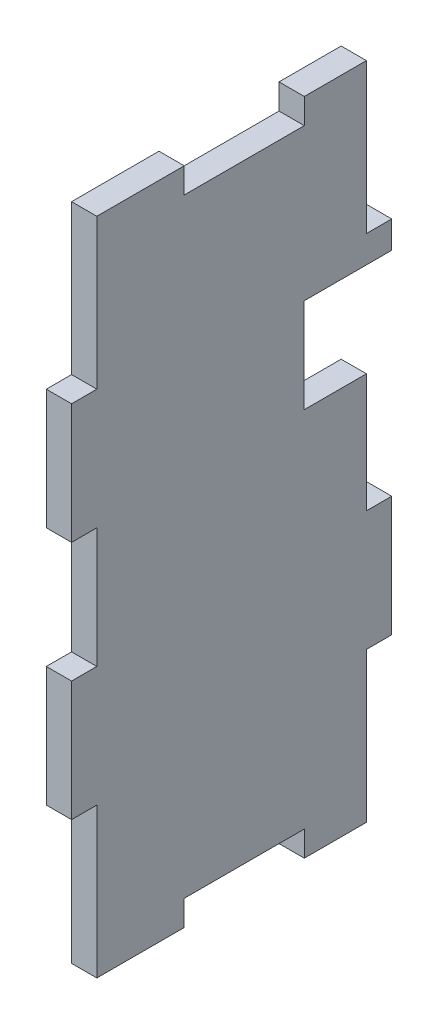
ISO-10303-21;
HEADER;
FILE_DESCRIPTION(('STEP AP214'),'2;1');
FILE_NAME('part.step','',(''),(''),'','','');
FILE_SCHEMA(('AUTOMOTIVE_DESIGN { 1 0 10303 214 1 1 1 1 }'));
ENDSEC;
DATA;
#1=APPLICATION_CONTEXT('core data for automotive mechanical design processes');
#2=APPLICATION_PROTOCOL_DEFINITION('international standard','automotive_design',2000,#1);
#3=PRODUCT_CONTEXT('',#1,'mechanical');
#4=PRODUCT('Part','Part','',(#3));
#5=PRODUCT_RELATED_PRODUCT_CATEGORY('part','',(#4));
#6=PRODUCT_DEFINITION_FORMATION('','',#4);
#7=PRODUCT_DEFINITION_CONTEXT('part definition',#1,'design');
#8=PRODUCT_DEFINITION('design','',#6,#7);
#9=PRODUCT_DEFINITION_SHAPE('','',#8);
#10=(LENGTH_UNIT() NAMED_UNIT(*) SI_UNIT(.MILLI.,.METRE.));
#11=(NAMED_UNIT(*) PLANE_ANGLE_UNIT() SI_UNIT($,.RADIAN.));
#12=(NAMED_UNIT(*) SI_UNIT($,.STERADIAN.) SOLID_ANGLE_UNIT());
#13=UNCERTAINTY_MEASURE_WITH_UNIT(LENGTH_MEASURE(1.E-05),#10,'distance_accuracy_value','');
#14=(GEOMETRIC_REPRESENTATION_CONTEXT(3) GLOBAL_UNCERTAINTY_ASSIGNED_CONTEXT((#13)) GLOBAL_UNIT_ASSIGNED_CONTEXT((#10,
#11,#12)) REPRESENTATION_CONTEXT('',''));
#15=CARTESIAN_POINT('',(0.,0.,0.));
#16=DIRECTION('',(0.,0.,1.));
#17=DIRECTION('',(1.,0.,0.));
#18=AXIS2_PLACEMENT_3D('',#15,#16,#17);
#19=CARTESIAN_POINT('',(3.,36.9830920693521,8.18285979631578));
#20=DIRECTION('',(0.,-1.,0.));
#21=DIRECTION('',(0.,0.,-1.));
#22=AXIS2_PLACEMENT_3D('',#19,#20,#21);
#23=PLANE('',#22);
#24=DIRECTION('',(0.,0.,1.));
#25=VECTOR('',#24,1.);
#26=CARTESIAN_POINT('',(0.,36.9830920693521,8.18285979631578));
#27=LINE('',#26,#25);
#28=CARTESIAN_POINT('',(0.,36.9830920693521,8.18285979631578));
#29=VERTEX_POINT('',#28);
#30=CARTESIAN_POINT('',(0.,36.9830920693521,18.5578597963158));
#31=VERTEX_POINT('',#30);
#32=EDGE_CURVE('E490',#29,#31,#27,.T.);
#33=ORIENTED_EDGE('',*,*,#32,.T.);
#34=DIRECTION('',(-1.,0.,0.));
#35=VECTOR('',#34,1.);
#36=CARTESIAN_POINT('',(3.,36.9830920693521,18.5578597963158));
#37=LINE('',#36,#35);
#38=CARTESIAN_POINT('',(3.,36.9830920693521,18.5578597963158));
#39=VERTEX_POINT('',#38);
#40=EDGE_CURVE('E531',#39,#31,#37,.T.);
#41=ORIENTED_EDGE('',*,*,#40,.F.);
#42=DIRECTION('',(0.,0.,1.));
#43=VECTOR('',#42,1.);
#44=CARTESIAN_POINT('',(3.,36.9830920693521,8.18285979631578));
#45=LINE('',#44,#43);
#46=CARTESIAN_POINT('',(3.,36.9830920693521,8.18285979631578));
#47=VERTEX_POINT('',#46);
#48=EDGE_CURVE('E280',#47,#39,#45,.T.);
#49=ORIENTED_EDGE('',*,*,#48,.F.);
#50=DIRECTION('',(-1.,0.,0.));
#51=VECTOR('',#50,1.);
#52=CARTESIAN_POINT('',(3.,36.9830920693521,8.18285979631578));
#53=LINE('',#52,#51);
#54=EDGE_CURVE('E264',#47,#29,#53,.T.);
#55=ORIENTED_EDGE('',*,*,#54,.T.);
#56=EDGE_LOOP('',(#33,#41,#49,#55));
#57=FACE_BOUND('',#56,.T.);
#58=ADVANCED_FACE('F46',(#57),#23,.F.);
#59=CARTESIAN_POINT('',(3.,36.9830920693521,18.5578597963158));
#60=DIRECTION('',(0.,0.,-1.));
#61=DIRECTION('',(-1.,0.,0.));
#62=AXIS2_PLACEMENT_3D('',#59,#60,#61);
#63=PLANE('',#62);
#64=DIRECTION('',(0.,-1.,0.));
#65=VECTOR('',#64,1.);
#66=CARTESIAN_POINT('',(0.,36.9830920693521,18.5578597963158));
#67=LINE('',#66,#65);
#68=CARTESIAN_POINT('',(0.,19.2080920693521,18.5578597963158));
#69=VERTEX_POINT('',#68);
#70=EDGE_CURVE('E487',#31,#69,#67,.T.);
#71=ORIENTED_EDGE('',*,*,#70,.T.);
#72=DIRECTION('',(-1.,0.,0.));
#73=VECTOR('',#72,1.);
#74=CARTESIAN_POINT('',(3.,19.2080920693521,18.5578597963158));
#75=LINE('',#74,#73);
#76=CARTESIAN_POINT('',(3.,19.2080920693521,18.5578597963158));
#77=VERTEX_POINT('',#76);
#78=EDGE_CURVE('E535',#77,#69,#75,.T.);
#79=ORIENTED_EDGE('',*,*,#78,.F.);
#80=DIRECTION('',(0.,-1.,0.));
#81=VECTOR('',#80,1.);
#82=CARTESIAN_POINT('',(3.,36.9830920693521,18.5578597963158));
#83=LINE('',#82,#81);
#84=EDGE_CURVE('E166',#39,#77,#83,.T.);
#85=ORIENTED_EDGE('',*,*,#84,.F.);
#86=ORIENTED_EDGE('',*,*,#40,.T.);
#87=EDGE_LOOP('',(#71,#79,#85,#86));
#88=FACE_BOUND('',#87,.T.);
#89=ADVANCED_FACE('F630',(#88),#63,.F.);
#90=CARTESIAN_POINT('',(3.,19.2080920693521,18.5578597963158));
#91=DIRECTION('',(0.,-1.,0.));
#92=DIRECTION('',(0.,0.,-1.));
#93=AXIS2_PLACEMENT_3D('',#90,#91,#92);
#94=PLANE('',#93);
#95=DIRECTION('',(0.,0.,1.));
#96=VECTOR('',#95,1.);
#97=CARTESIAN_POINT('',(0.,19.2080920693521,18.5578597963158));
#98=LINE('',#97,#96);
#99=CARTESIAN_POINT('',(0.,19.2080920693521,21.5578597963158));
#100=VERTEX_POINT('',#99);
#101=EDGE_CURVE('E484',#69,#100,#98,.T.);
#102=ORIENTED_EDGE('',*,*,#101,.T.);
#103=DIRECTION('',(-1.,0.,0.));
#104=VECTOR('',#103,1.);
#105=CARTESIAN_POINT('',(3.,19.2080920693521,21.5578597963158));
#106=LINE('',#105,#104);
#107=CARTESIAN_POINT('',(3.,19.2080920693521,21.5578597963158));
#108=VERTEX_POINT('',#107);
#109=EDGE_CURVE('E541',#108,#100,#106,.T.);
#110=ORIENTED_EDGE('',*,*,#109,.F.);
#111=DIRECTION('',(0.,0.,1.));
#112=VECTOR('',#111,1.);
#113=CARTESIAN_POINT('',(3.,19.2080920693521,18.5578597963158));
#114=LINE('',#113,#112);
#115=EDGE_CURVE('E289',#77,#108,#114,.T.);
#116=ORIENTED_EDGE('',*,*,#115,.F.);
#117=ORIENTED_EDGE('',*,*,#78,.T.);
#118=EDGE_LOOP('',(#102,#110,#116,#117));
#119=FACE_BOUND('',#118,.T.);
#120=ADVANCED_FACE('F632',(#119),#94,.F.);
#121=CARTESIAN_POINT('',(3.,19.2080920693521,21.5578597963158));
#122=DIRECTION('',(0.,0.,-1.));
#123=DIRECTION('',(-1.,0.,0.));
#124=AXIS2_PLACEMENT_3D('',#121,#122,#123);
#125=PLANE('',#124);
#126=DIRECTION('',(0.,-1.,0.));
#127=VECTOR('',#126,1.);
#128=CARTESIAN_POINT('',(0.,19.2080920693521,21.5578597963158));
#129=LINE('',#128,#127);
#130=CARTESIAN_POINT('',(0.,4.95809206935212,21.5578597963158));
#131=VERTEX_POINT('',#130);
#132=EDGE_CURVE('E481',#100,#131,#129,.T.);
#133=ORIENTED_EDGE('',*,*,#132,.T.);
#134=DIRECTION('',(-1.,0.,0.));
#135=VECTOR('',#134,1.);
#136=CARTESIAN_POINT('',(3.,4.95809206935212,21.5578597963158));
#137=LINE('',#136,#135);
#138=CARTESIAN_POINT('',(3.,4.95809206935212,21.5578597963158));
#139=VERTEX_POINT('',#138);
#140=EDGE_CURVE('E545',#139,#131,#137,.T.);
#141=ORIENTED_EDGE('',*,*,#140,.F.);
#142=DIRECTION('',(0.,-1.,0.));
#143=VECTOR('',#142,1.);
#144=CARTESIAN_POINT('',(3.,19.2080920693521,21.5578597963158));
#145=LINE('',#144,#143);
#146=EDGE_CURVE('E293',#108,#139,#145,.T.);
#147=ORIENTED_EDGE('',*,*,#146,.F.);
#148=ORIENTED_EDGE('',*,*,#109,.T.);
#149=EDGE_LOOP('',(#133,#141,#147,#148));
#150=FACE_BOUND('',#149,.T.);
#151=ADVANCED_FACE('F637',(#150),#125,.F.);
#152=CARTESIAN_POINT('',(3.,4.95809206935212,21.5578597963158));
#153=DIRECTION('',(0.,1.,0.));
#154=DIRECTION('',(0.,0.,1.));
#155=AXIS2_PLACEMENT_3D('',#152,#153,#154);
#156=PLANE('',#155);
#157=DIRECTION('',(0.,0.,-1.));
#158=VECTOR('',#157,1.);
#159=CARTESIAN_POINT('',(0.,4.95809206935212,21.5578597963158));
#160=LINE('',#159,#158);
#161=CARTESIAN_POINT('',(0.,4.95809206935212,18.5578597963158));
#162=VERTEX_POINT('',#161);
#163=EDGE_CURVE('E478',#131,#162,#160,.T.);
#164=ORIENTED_EDGE('',*,*,#163,.T.);
#165=DIRECTION('',(-1.,0.,0.));
#166=VECTOR('',#165,1.);
#167=CARTESIAN_POINT('',(3.,4.95809206935212,18.5578597963158));
#168=LINE('',#167,#166);
#169=CARTESIAN_POINT('',(3.,4.95809206935212,18.5578597963158));
#170=VERTEX_POINT('',#169);
#171=EDGE_CURVE('E549',#170,#162,#168,.T.);
#172=ORIENTED_EDGE('',*,*,#171,.F.);
#173=DIRECTION('',(0.,0.,-1.));
#174=VECTOR('',#173,1.);
#175=CARTESIAN_POINT('',(3.,4.95809206935212,21.5578597963158));
#176=LINE('',#175,#174);
#177=EDGE_CURVE('E301',#139,#170,#176,.T.);
#178=ORIENTED_EDGE('',*,*,#177,.F.);
#179=ORIENTED_EDGE('',*,*,#140,.T.);
#180=EDGE_LOOP('',(#164,#172,#178,#179));
#181=FACE_BOUND('',#180,.T.);
#182=ADVANCED_FACE('F643',(#181),#156,.F.);
#183=CARTESIAN_POINT('',(3.,4.95809206935212,18.5578597963158));
#184=DIRECTION('',(0.,0.,-1.));
#185=DIRECTION('',(-1.,0.,0.));
#186=AXIS2_PLACEMENT_3D('',#183,#184,#185);
#187=PLANE('',#186);
#188=DIRECTION('',(0.,-1.,0.));
#189=VECTOR('',#188,1.);
#190=CARTESIAN_POINT('',(0.,4.95809206935212,18.5578597963158));
#191=LINE('',#190,#189);
#192=CARTESIAN_POINT('',(0.,-9.29190793064787,18.5578597963158));
#193=VERTEX_POINT('',#192);
#194=EDGE_CURVE('E475',#162,#193,#191,.T.);
#195=ORIENTED_EDGE('',*,*,#194,.T.);
#196=DIRECTION('',(-1.,0.,0.));
#197=VECTOR('',#196,1.);
#198=CARTESIAN_POINT('',(3.,-9.29190793064787,18.5578597963158));
#199=LINE('',#198,#197);
#200=CARTESIAN_POINT('',(3.,-9.29190793064787,18.5578597963158));
#201=VERTEX_POINT('',#200);
#202=EDGE_CURVE('E553',#201,#193,#199,.T.);
#203=ORIENTED_EDGE('',*,*,#202,.F.);
#204=DIRECTION('',(0.,-1.,0.));
#205=VECTOR('',#204,1.);
#206=CARTESIAN_POINT('',(3.,4.95809206935212,18.5578597963158));
#207=LINE('',#206,#205);
#208=EDGE_CURVE('E304',#170,#201,#207,.T.);
#209=ORIENTED_EDGE('',*,*,#208,.F.);
#210=ORIENTED_EDGE('',*,*,#171,.T.);
#211=EDGE_LOOP('',(#195,#203,#209,#210));
#212=FACE_BOUND('',#211,.T.);
#213=ADVANCED_FACE('F647',(#212),#187,.F.);
#214=CARTESIAN_POINT('',(3.,-9.29190793064787,18.5578597963158));
#215=DIRECTION('',(0.,-1.,0.));
#216=DIRECTION('',(0.,0.,-1.));
#217=AXIS2_PLACEMENT_3D('',#214,#215,#216);
#218=PLANE('',#217);
#219=DIRECTION('',(0.,0.,1.));
#220=VECTOR('',#219,1.);
#221=CARTESIAN_POINT('',(0.,-9.29190793064787,18.5578597963158));
#222=LINE('',#221,#220);
#223=CARTESIAN_POINT('',(0.,-9.29190793064787,21.5578597963158));
#224=VERTEX_POINT('',#223);
#225=EDGE_CURVE('E472',#193,#224,#222,.T.);
#226=ORIENTED_EDGE('',*,*,#225,.T.);
#227=DIRECTION('',(-1.,0.,0.));
#228=VECTOR('',#227,1.);
#229=CARTESIAN_POINT('',(3.,-9.29190793064787,21.5578597963158));
#230=LINE('',#229,#228);
#231=CARTESIAN_POINT('',(3.,-9.29190793064787,21.5578597963158));
#232=VERTEX_POINT('',#231);
#233=EDGE_CURVE('E557',#232,#224,#230,.T.);
#234=ORIENTED_EDGE('',*,*,#233,.F.);
#235=DIRECTION('',(0.,0.,1.));
#236=VECTOR('',#235,1.);
#237=CARTESIAN_POINT('',(3.,-9.29190793064787,18.5578597963158));
#238=LINE('',#237,#236);
#239=EDGE_CURVE('E308',#201,#232,#238,.T.);
#240=ORIENTED_EDGE('',*,*,#239,.F.);
#241=ORIENTED_EDGE('',*,*,#202,.T.);
#242=EDGE_LOOP('',(#226,#234,#240,#241));
#243=FACE_BOUND('',#242,.T.);
#244=ADVANCED_FACE('F651',(#243),#218,.F.);
#245=CARTESIAN_POINT('',(3.,-9.29190793064787,21.5578597963158));
#246=DIRECTION('',(0.,0.,-1.));
#247=DIRECTION('',(-1.,0.,0.));
#248=AXIS2_PLACEMENT_3D('',#245,#246,#247);
#249=PLANE('',#248);
#250=DIRECTION('',(0.,-1.,0.));
#251=VECTOR('',#250,1.);
#252=CARTESIAN_POINT('',(0.,-9.29190793064787,21.5578597963158));
#253=LINE('',#252,#251);
#254=CARTESIAN_POINT('',(0.,-23.5419079306479,21.5578597963158));
#255=VERTEX_POINT('',#254);
#256=EDGE_CURVE('E469',#224,#255,#253,.T.);
#257=ORIENTED_EDGE('',*,*,#256,.T.);
#258=DIRECTION('',(-1.,0.,0.));
#259=VECTOR('',#258,1.);
#260=CARTESIAN_POINT('',(3.,-23.5419079306479,21.5578597963158));
#261=LINE('',#260,#259);
#262=CARTESIAN_POINT('',(3.,-23.5419079306479,21.5578597963158));
#263=VERTEX_POINT('',#262);
#264=EDGE_CURVE('E561',#263,#255,#261,.T.);
#265=ORIENTED_EDGE('',*,*,#264,.F.);
#266=DIRECTION('',(0.,-1.,0.));
#267=VECTOR('',#266,1.);
#268=CARTESIAN_POINT('',(3.,-9.29190793064787,21.5578597963158));
#269=LINE('',#268,#267);
#270=EDGE_CURVE('E312',#232,#263,#269,.T.);
#271=ORIENTED_EDGE('',*,*,#270,.F.);
#272=ORIENTED_EDGE('',*,*,#233,.T.);
#273=EDGE_LOOP('',(#257,#265,#271,#272));
#274=FACE_BOUND('',#273,.T.);
#275=ADVANCED_FACE('F655',(#274),#249,.F.);
#276=CARTESIAN_POINT('',(3.,-23.5419079306479,21.5578597963158));
#277=DIRECTION('',(0.,1.,0.));
#278=DIRECTION('',(0.,0.,1.));
#279=AXIS2_PLACEMENT_3D('',#276,#277,#278);
#280=PLANE('',#279);
#281=DIRECTION('',(0.,0.,-1.));
#282=VECTOR('',#281,1.);
#283=CARTESIAN_POINT('',(0.,-23.5419079306479,21.5578597963158));
#284=LINE('',#283,#282);
#285=CARTESIAN_POINT('',(0.,-23.5419079306479,18.5578597963158));
#286=VERTEX_POINT('',#285);
#287=EDGE_CURVE('E465',#255,#286,#284,.T.);
#288=ORIENTED_EDGE('',*,*,#287,.T.);
#289=DIRECTION('',(-1.,0.,0.));
#290=VECTOR('',#289,1.);
#291=CARTESIAN_POINT('',(3.,-23.5419079306479,18.5578597963158));
#292=LINE('',#291,#290);
#293=CARTESIAN_POINT('',(3.,-23.5419079306479,18.5578597963158));
#294=VERTEX_POINT('',#293);
#295=EDGE_CURVE('E565',#294,#286,#292,.T.);
#296=ORIENTED_EDGE('',*,*,#295,.F.);
#297=DIRECTION('',(0.,0.,-1.));
#298=VECTOR('',#297,1.);
#299=CARTESIAN_POINT('',(3.,-23.5419079306479,21.5578597963158));
#300=LINE('',#299,#298);
#301=EDGE_CURVE('E320',#263,#294,#300,.T.);
#302=ORIENTED_EDGE('',*,*,#301,.F.);
#303=ORIENTED_EDGE('',*,*,#264,.T.);
#304=EDGE_LOOP('',(#288,#296,#302,#303));
#305=FACE_BOUND('',#304,.T.);
#306=ADVANCED_FACE('F659',(#305),#280,.F.);
#307=CARTESIAN_POINT('',(3.,-37.7919079306479,18.5578597963158));
#308=DIRECTION('',(0.,0.,-1.));
#309=DIRECTION('',(-1.,0.,0.));
#310=AXIS2_PLACEMENT_3D('',#307,#308,#309);
#311=PLANE('',#310);
#312=DIRECTION('',(0.,-1.,0.));
#313=VECTOR('',#312,1.);
#314=CARTESIAN_POINT('',(0.,-37.7919079306479,18.5578597963158));
#315=LINE('',#314,#313);
#316=CARTESIAN_POINT('',(0.,-41.3169079306479,18.5578597963158));
#317=VERTEX_POINT('',#316);
#318=EDGE_CURVE('E462',#286,#317,#315,.T.);
#319=ORIENTED_EDGE('',*,*,#318,.T.);
#320=DIRECTION('',(-1.,0.,0.));
#321=VECTOR('',#320,1.);
#322=CARTESIAN_POINT('',(3.,-41.3169079306479,18.5578597963158));
#323=LINE('',#322,#321);
#324=CARTESIAN_POINT('',(3.,-41.3169079306479,18.5578597963158));
#325=VERTEX_POINT('',#324);
#326=EDGE_CURVE('E569',#325,#317,#323,.T.);
#327=ORIENTED_EDGE('',*,*,#326,.F.);
#328=DIRECTION('',(0.,-1.,0.));
#329=VECTOR('',#328,1.);
#330=CARTESIAN_POINT('',(3.,-23.5419079306479,18.5578597963158));
#331=LINE('',#330,#329);
#332=EDGE_CURVE('E323',#294,#325,#331,.T.);
#333=ORIENTED_EDGE('',*,*,#332,.F.);
#334=ORIENTED_EDGE('',*,*,#295,.T.);
#335=EDGE_LOOP('',(#319,#327,#333,#334));
#336=FACE_BOUND('',#335,.T.);
#337=ADVANCED_FACE('F663',(#336),#311,.F.);
#338=CARTESIAN_POINT('',(3.,-41.3169079306479,18.5578597963158));
#339=DIRECTION('',(0.,1.,0.));
#340=DIRECTION('',(0.,0.,1.));
#341=AXIS2_PLACEMENT_3D('',#338,#339,#340);
#342=PLANE('',#341);
#343=DIRECTION('',(0.,0.,-1.));
#344=VECTOR('',#343,1.);
#345=CARTESIAN_POINT('',(0.,-41.3169079306479,18.5578597963158));
#346=LINE('',#345,#344);
#347=CARTESIAN_POINT('',(0.,-41.3169079306479,8.18285979631578));
#348=VERTEX_POINT('',#347);
#349=EDGE_CURVE('E459',#317,#348,#346,.T.);
#350=ORIENTED_EDGE('',*,*,#349,.T.);
#351=DIRECTION('',(-1.,0.,0.));
#352=VECTOR('',#351,1.);
#353=CARTESIAN_POINT('',(3.,-41.3169079306479,8.18285979631578));
#354=LINE('',#353,#352);
#355=CARTESIAN_POINT('',(3.,-41.3169079306479,8.18285979631578));
#356=VERTEX_POINT('',#355);
#357=EDGE_CURVE('E573',#356,#348,#354,.T.);
#358=ORIENTED_EDGE('',*,*,#357,.F.);
#359=DIRECTION('',(0.,0.,-1.));
#360=VECTOR('',#359,1.);
#361=CARTESIAN_POINT('',(3.,-41.3169079306479,18.5578597963158));
#362=LINE('',#361,#360);
#363=EDGE_CURVE('E327',#325,#356,#362,.T.);
#364=ORIENTED_EDGE('',*,*,#363,.F.);
#365=ORIENTED_EDGE('',*,*,#326,.T.);
#366=EDGE_LOOP('',(#350,#358,#364,#365));
#367=FACE_BOUND('',#366,.T.);
#368=ADVANCED_FACE('F667',(#367),#342,.F.);
#369=CARTESIAN_POINT('',(3.,-41.3169079306479,8.18285979631578));
#370=DIRECTION('',(0.,0.,1.));
#371=DIRECTION('',(1.,0.,0.));
#372=AXIS2_PLACEMENT_3D('',#369,#370,#371);
#373=PLANE('',#372);
#374=DIRECTION('',(0.,1.,0.));
#375=VECTOR('',#374,1.);
#376=CARTESIAN_POINT('',(0.,-41.3169079306479,8.18285979631578));
#377=LINE('',#376,#375);
#378=CARTESIAN_POINT('',(0.,-38.3169079306479,8.18285979631578));
#379=VERTEX_POINT('',#378);
#380=EDGE_CURVE('E456',#348,#379,#377,.T.);
#381=ORIENTED_EDGE('',*,*,#380,.T.);
#382=DIRECTION('',(-1.,0.,0.));
#383=VECTOR('',#382,1.);
#384=CARTESIAN_POINT('',(3.,-38.3169079306479,8.18285979631578));
#385=LINE('',#384,#383);
#386=CARTESIAN_POINT('',(3.,-38.3169079306479,8.18285979631578));
#387=VERTEX_POINT('',#386);
#388=EDGE_CURVE('E577',#387,#379,#385,.T.);
#389=ORIENTED_EDGE('',*,*,#388,.F.);
#390=DIRECTION('',(0.,1.,0.));
#391=VECTOR('',#390,1.);
#392=CARTESIAN_POINT('',(3.,-41.3169079306479,8.18285979631578));
#393=LINE('',#392,#391);
#394=EDGE_CURVE('E331',#356,#387,#393,.T.);
#395=ORIENTED_EDGE('',*,*,#394,.F.);
#396=ORIENTED_EDGE('',*,*,#357,.T.);
#397=EDGE_LOOP('',(#381,#389,#395,#396));
#398=FACE_BOUND('',#397,.T.);
#399=ADVANCED_FACE('F671',(#398),#373,.F.);
#400=CARTESIAN_POINT('',(3.,-38.3169079306479,8.18285979631578));
#401=DIRECTION('',(0.,1.,0.));
#402=DIRECTION('',(0.,0.,1.));
#403=AXIS2_PLACEMENT_3D('',#400,#401,#402);
#404=PLANE('',#403);
#405=DIRECTION('',(0.,0.,-1.));
#406=VECTOR('',#405,1.);
#407=CARTESIAN_POINT('',(0.,-38.3169079306479,8.18285979631578));
#408=LINE('',#407,#406);
#409=CARTESIAN_POINT('',(0.,-38.3169079306479,-6.06714020368422));
#410=VERTEX_POINT('',#409);
#411=EDGE_CURVE('E453',#379,#410,#408,.T.);
#412=ORIENTED_EDGE('',*,*,#411,.T.);
#413=DIRECTION('',(-1.,0.,0.));
#414=VECTOR('',#413,1.);
#415=CARTESIAN_POINT('',(3.,-38.3169079306479,-6.06714020368422));
#416=LINE('',#415,#414);
#417=CARTESIAN_POINT('',(3.,-38.3169079306479,-6.06714020368422));
#418=VERTEX_POINT('',#417);
#419=EDGE_CURVE('E581',#418,#410,#416,.T.);
#420=ORIENTED_EDGE('',*,*,#419,.F.);
#421=DIRECTION('',(0.,0.,-1.));
#422=VECTOR('',#421,1.);
#423=CARTESIAN_POINT('',(3.,-38.3169079306479,8.18285979631578));
#424=LINE('',#423,#422);
#425=EDGE_CURVE('E339',#387,#418,#424,.T.);
#426=ORIENTED_EDGE('',*,*,#425,.F.);
#427=ORIENTED_EDGE('',*,*,#388,.T.);
#428=EDGE_LOOP('',(#412,#420,#426,#427));
#429=FACE_BOUND('',#428,.T.);
#430=ADVANCED_FACE('F675',(#429),#404,.F.);
#431=CARTESIAN_POINT('',(3.,-38.3169079306479,-6.06714020368422));
#432=DIRECTION('',(0.,0.,-1.));
#433=DIRECTION('',(-1.,0.,0.));
#434=AXIS2_PLACEMENT_3D('',#431,#432,#433);
#435=PLANE('',#434);
#436=DIRECTION('',(0.,-1.,0.));
#437=VECTOR('',#436,1.);
#438=CARTESIAN_POINT('',(0.,-38.3169079306479,-6.06714020368422));
#439=LINE('',#438,#437);
#440=CARTESIAN_POINT('',(0.,-41.3169079306479,-6.06714020368422));
#441=VERTEX_POINT('',#440);
#442=EDGE_CURVE('E450',#410,#441,#439,.T.);
#443=ORIENTED_EDGE('',*,*,#442,.T.);
#444=DIRECTION('',(-1.,0.,0.));
#445=VECTOR('',#444,1.);
#446=CARTESIAN_POINT('',(3.,-41.3169079306479,-6.06714020368422));
#447=LINE('',#446,#445);
#448=CARTESIAN_POINT('',(3.,-41.3169079306479,-6.06714020368422));
#449=VERTEX_POINT('',#448);
#450=EDGE_CURVE('E585',#449,#441,#447,.T.);
#451=ORIENTED_EDGE('',*,*,#450,.F.);
#452=DIRECTION('',(0.,-1.,0.));
#453=VECTOR('',#452,1.);
#454=CARTESIAN_POINT('',(3.,-38.3169079306479,-6.06714020368422));
#455=LINE('',#454,#453);
#456=EDGE_CURVE('E342',#418,#449,#455,.T.);
#457=ORIENTED_EDGE('',*,*,#456,.F.);
#458=ORIENTED_EDGE('',*,*,#419,.T.);
#459=EDGE_LOOP('',(#443,#451,#457,#458));
#460=FACE_BOUND('',#459,.T.);
#461=ADVANCED_FACE('F679',(#460),#435,.F.);
#462=CARTESIAN_POINT('',(3.,-41.3169079306479,-6.06714020368422));
#463=DIRECTION('',(0.,1.,0.));
#464=DIRECTION('',(0.,0.,1.));
#465=AXIS2_PLACEMENT_3D('',#462,#463,#464);
#466=PLANE('',#465);
#467=DIRECTION('',(0.,0.,-1.));
#468=VECTOR('',#467,1.);
#469=CARTESIAN_POINT('',(0.,-41.3169079306479,-6.06714020368422));
#470=LINE('',#469,#468);
#471=CARTESIAN_POINT('',(0.,-41.3169079306479,-13.4421402036842));
#472=VERTEX_POINT('',#471);
#473=EDGE_CURVE('E447',#441,#472,#470,.T.);
#474=ORIENTED_EDGE('',*,*,#473,.T.);
#475=DIRECTION('',(-1.,0.,0.));
#476=VECTOR('',#475,1.);
#477=CARTESIAN_POINT('',(3.,-41.3169079306479,-13.4421402036842));
#478=LINE('',#477,#476);
#479=CARTESIAN_POINT('',(3.,-41.3169079306479,-13.4421402036842));
#480=VERTEX_POINT('',#479);
#481=EDGE_CURVE('E589',#480,#472,#478,.T.);
#482=ORIENTED_EDGE('',*,*,#481,.F.);
#483=DIRECTION('',(0.,0.,-1.));
#484=VECTOR('',#483,1.);
#485=CARTESIAN_POINT('',(3.,-41.3169079306479,-6.06714020368422));
#486=LINE('',#485,#484);
#487=EDGE_CURVE('E346',#449,#480,#486,.T.);
#488=ORIENTED_EDGE('',*,*,#487,.F.);
#489=ORIENTED_EDGE('',*,*,#450,.T.);
#490=EDGE_LOOP('',(#474,#482,#488,#489));
#491=FACE_BOUND('',#490,.T.);
#492=ADVANCED_FACE('F683',(#491),#466,.F.);
#493=CARTESIAN_POINT('',(3.,-41.3169079306479,-13.4421402036842));
#494=DIRECTION('',(0.,0.,1.));
#495=DIRECTION('',(1.,0.,0.));
#496=AXIS2_PLACEMENT_3D('',#493,#494,#495);
#497=PLANE('',#496);
#498=DIRECTION('',(0.,1.,0.));
#499=VECTOR('',#498,1.);
#500=CARTESIAN_POINT('',(0.,-41.3169079306479,-13.4421402036842));
#501=LINE('',#500,#499);
#502=CARTESIAN_POINT('',(0.,-23.5419079306479,-13.4421402036842));
#503=VERTEX_POINT('',#502);
#504=EDGE_CURVE('E444',#472,#503,#501,.T.);
#505=ORIENTED_EDGE('',*,*,#504,.T.);
#506=DIRECTION('',(-1.,0.,0.));
#507=VECTOR('',#506,1.);
#508=CARTESIAN_POINT('',(3.,-23.5419079306479,-13.4421402036842));
#509=LINE('',#508,#507);
#510=CARTESIAN_POINT('',(3.,-23.5419079306479,-13.4421402036842));
#511=VERTEX_POINT('',#510);
#512=EDGE_CURVE('E593',#511,#503,#509,.T.);
#513=ORIENTED_EDGE('',*,*,#512,.F.);
#514=DIRECTION('',(0.,1.,0.));
#515=VECTOR('',#514,1.);
#516=CARTESIAN_POINT('',(3.,-41.3169079306479,-13.4421402036842));
#517=LINE('',#516,#515);
#518=EDGE_CURVE('E350',#480,#511,#517,.T.);
#519=ORIENTED_EDGE('',*,*,#518,.F.);
#520=ORIENTED_EDGE('',*,*,#481,.T.);
#521=EDGE_LOOP('',(#505,#513,#519,#520));
#522=FACE_BOUND('',#521,.T.);
#523=ADVANCED_FACE('F687',(#522),#497,.F.);
#524=CARTESIAN_POINT('',(3.,-23.5419079306479,-13.4421402036842));
#525=DIRECTION('',(0.,1.,0.));
#526=DIRECTION('',(0.,0.,1.));
#527=AXIS2_PLACEMENT_3D('',#524,#525,#526);
#528=PLANE('',#527);
#529=DIRECTION('',(0.,0.,-1.));
#530=VECTOR('',#529,1.);
#531=CARTESIAN_POINT('',(0.,-23.5419079306479,-13.4421402036842));
#532=LINE('',#531,#530);
#533=CARTESIAN_POINT('',(0.,-23.5419079306479,-16.4421402036842));
#534=VERTEX_POINT('',#533);
#535=EDGE_CURVE('E441',#503,#534,#532,.T.);
#536=ORIENTED_EDGE('',*,*,#535,.T.);
#537=DIRECTION('',(-1.,0.,0.));
#538=VECTOR('',#537,1.);
#539=CARTESIAN_POINT('',(3.,-23.5419079306479,-16.4421402036842));
#540=LINE('',#539,#538);
#541=CARTESIAN_POINT('',(3.,-23.5419079306479,-16.4421402036842));
#542=VERTEX_POINT('',#541);
#543=EDGE_CURVE('E597',#542,#534,#540,.T.);
#544=ORIENTED_EDGE('',*,*,#543,.F.);
#545=DIRECTION('',(0.,0.,-1.));
#546=VECTOR('',#545,1.);
#547=CARTESIAN_POINT('',(3.,-23.5419079306479,-13.4421402036842));
#548=LINE('',#547,#546);
#549=EDGE_CURVE('E358',#511,#542,#548,.T.);
#550=ORIENTED_EDGE('',*,*,#549,.F.);
#551=ORIENTED_EDGE('',*,*,#512,.T.);
#552=EDGE_LOOP('',(#536,#544,#550,#551));
#553=FACE_BOUND('',#552,.T.);
#554=ADVANCED_FACE('F691',(#553),#528,.F.);
#555=CARTESIAN_POINT('',(3.,-23.5419079306479,-16.4421402036842));
#556=DIRECTION('',(0.,0.,1.));
#557=DIRECTION('',(1.,0.,0.));
#558=AXIS2_PLACEMENT_3D('',#555,#556,#557);
#559=PLANE('',#558);
#560=DIRECTION('',(0.,1.,0.));
#561=VECTOR('',#560,1.);
#562=CARTESIAN_POINT('',(0.,-23.5419079306479,-16.4421402036842));
#563=LINE('',#562,#561);
#564=CARTESIAN_POINT('',(0.,-9.29190793064787,-16.4421402036842));
#565=VERTEX_POINT('',#564);
#566=EDGE_CURVE('E438',#534,#565,#563,.T.);
#567=ORIENTED_EDGE('',*,*,#566,.T.);
#568=DIRECTION('',(-1.,0.,0.));
#569=VECTOR('',#568,1.);
#570=CARTESIAN_POINT('',(3.,-9.29190793064787,-16.4421402036842));
#571=LINE('',#570,#569);
#572=CARTESIAN_POINT('',(3.,-9.29190793064787,-16.4421402036842));
#573=VERTEX_POINT('',#572);
#574=EDGE_CURVE('E601',#573,#565,#571,.T.);
#575=ORIENTED_EDGE('',*,*,#574,.F.);
#576=DIRECTION('',(0.,1.,0.));
#577=VECTOR('',#576,1.);
#578=CARTESIAN_POINT('',(3.,-23.5419079306479,-16.4421402036842));
#579=LINE('',#578,#577);
#580=EDGE_CURVE('E361',#542,#573,#579,.T.);
#581=ORIENTED_EDGE('',*,*,#580,.F.);
#582=ORIENTED_EDGE('',*,*,#543,.T.);
#583=EDGE_LOOP('',(#567,#575,#581,#582));
#584=FACE_BOUND('',#583,.T.);
#585=ADVANCED_FACE('F695',(#584),#559,.F.);
#586=CARTESIAN_POINT('',(3.,-9.29190793064787,-16.4421402036842));
#587=DIRECTION('',(0.,-1.,0.));
#588=DIRECTION('',(0.,0.,-1.));
#589=AXIS2_PLACEMENT_3D('',#586,#587,#588);
#590=PLANE('',#589);
#591=DIRECTION('',(0.,0.,1.));
#592=VECTOR('',#591,1.);
#593=CARTESIAN_POINT('',(0.,-9.29190793064787,-16.4421402036842));
#594=LINE('',#593,#592);
#595=CARTESIAN_POINT('',(0.,-9.29190793064787,-13.4421402036842));
#596=VERTEX_POINT('',#595);
#597=EDGE_CURVE('E435',#565,#596,#594,.T.);
#598=ORIENTED_EDGE('',*,*,#597,.T.);
#599=DIRECTION('',(-1.,0.,0.));
#600=VECTOR('',#599,1.);
#601=CARTESIAN_POINT('',(3.,-9.29190793064787,-13.4421402036842));
#602=LINE('',#601,#600);
#603=CARTESIAN_POINT('',(3.,-9.29190793064787,-13.4421402036842));
#604=VERTEX_POINT('',#603);
#605=EDGE_CURVE('E523',#604,#596,#602,.T.);
#606=ORIENTED_EDGE('',*,*,#605,.F.);
#607=DIRECTION('',(0.,0.,1.));
#608=VECTOR('',#607,1.);
#609=CARTESIAN_POINT('',(3.,-9.29190793064787,-16.4421402036842));
#610=LINE('',#609,#608);
#611=EDGE_CURVE('E365',#573,#604,#610,.T.);
#612=ORIENTED_EDGE('',*,*,#611,.F.);
#613=ORIENTED_EDGE('',*,*,#574,.T.);
#614=EDGE_LOOP('',(#598,#606,#612,#613));
#615=FACE_BOUND('',#614,.T.);
#616=ADVANCED_FACE('F699',(#615),#590,.F.);
#617=CARTESIAN_POINT('',(3.,-9.29190793064787,-13.4421402036842));
#618=DIRECTION('',(0.,0.,1.));
#619=DIRECTION('',(1.,0.,0.));
#620=AXIS2_PLACEMENT_3D('',#617,#618,#619);
#621=PLANE('',#620);
#622=DIRECTION('',(0.,1.,0.));
#623=VECTOR('',#622,1.);
#624=CARTESIAN_POINT('',(0.,-9.29190793064787,-13.4421402036842));
#625=LINE('',#624,#623);
#626=CARTESIAN_POINT('',(0.,4.79097985341768,-13.4421402036842));
#627=VERTEX_POINT('',#626);
#628=EDGE_CURVE('E431',#596,#627,#625,.T.);
#629=ORIENTED_EDGE('',*,*,#628,.T.);
#630=DIRECTION('',(1.,0.,0.));
#631=VECTOR('',#630,1.);
#632=CARTESIAN_POINT('',(3.,4.79097985341768,-13.4421402036842));
#633=LINE('',#632,#631);
#634=CARTESIAN_POINT('',(3.,4.79097985341768,-13.4421402036842));
#635=VERTEX_POINT('',#634);
#636=EDGE_CURVE('E61',#627,#635,#633,.T.);
#637=ORIENTED_EDGE('',*,*,#636,.T.);
#638=DIRECTION('',(0.,1.,0.));
#639=VECTOR('',#638,1.);
#640=CARTESIAN_POINT('',(3.,-9.29190793064787,-13.4421402036842));
#641=LINE('',#640,#639);
#642=EDGE_CURVE('E369',#604,#635,#641,.T.);
#643=ORIENTED_EDGE('',*,*,#642,.F.);
#644=ORIENTED_EDGE('',*,*,#605,.T.);
#645=EDGE_LOOP('',(#629,#637,#643,#644));
#646=FACE_BOUND('',#645,.T.);
#647=ADVANCED_FACE('F519',(#646),#621,.F.);
#648=CARTESIAN_POINT('',(3.,4.95809206935212,-16.4421402036842));
#649=DIRECTION('',(0.,0.,1.));
#650=DIRECTION('',(1.,0.,0.));
#651=AXIS2_PLACEMENT_3D('',#648,#649,#650);
#652=PLANE('',#651);
#653=DIRECTION('',(0.,1.,0.));
#654=VECTOR('',#653,1.);
#655=CARTESIAN_POINT('',(3.,4.95809206935212,-16.4421402036842));
#656=LINE('',#655,#654);
#657=CARTESIAN_POINT('',(3.,15.9830920693521,-16.4421402036842));
#658=VERTEX_POINT('',#657);
#659=CARTESIAN_POINT('',(3.,19.2080920693521,-16.4421402036842));
#660=VERTEX_POINT('',#659);
#661=EDGE_CURVE('E393',#658,#660,#656,.T.);
#662=ORIENTED_EDGE('',*,*,#661,.F.);
#663=DIRECTION('',(-1.,0.,0.));
#664=VECTOR('',#663,1.);
#665=CARTESIAN_POINT('',(3.,15.9830920693521,-16.4421402036842));
#666=LINE('',#665,#664);
#667=CARTESIAN_POINT('',(0.,15.9830920693521,-16.4421402036842));
#668=VERTEX_POINT('',#667);
#669=EDGE_CURVE('E284',#658,#668,#666,.T.);
#670=ORIENTED_EDGE('',*,*,#669,.T.);
#671=DIRECTION('',(0.,1.,0.));
#672=VECTOR('',#671,1.);
#673=CARTESIAN_POINT('',(0.,4.95809206935212,-16.4421402036842));
#674=LINE('',#673,#672);
#675=CARTESIAN_POINT('',(0.,19.2080920693521,-16.4421402036842));
#676=VERTEX_POINT('',#675);
#677=EDGE_CURVE('E428',#668,#676,#674,.T.);
#678=ORIENTED_EDGE('',*,*,#677,.T.);
#679=DIRECTION('',(-1.,0.,0.));
#680=VECTOR('',#679,1.);
#681=CARTESIAN_POINT('',(3.,19.2080920693521,-16.4421402036842));
#682=LINE('',#681,#680);
#683=EDGE_CURVE('E607',#660,#676,#682,.T.);
#684=ORIENTED_EDGE('',*,*,#683,.F.);
#685=EDGE_LOOP('',(#662,#670,#678,#684));
#686=FACE_BOUND('',#685,.T.);
#687=ADVANCED_FACE('F706',(#686),#652,.F.);
#688=CARTESIAN_POINT('',(3.,19.2080920693521,-16.4421402036842));
#689=DIRECTION('',(0.,-1.,0.));
#690=DIRECTION('',(0.,0.,-1.));
#691=AXIS2_PLACEMENT_3D('',#688,#689,#690);
#692=PLANE('',#691);
#693=DIRECTION('',(0.,0.,1.));
#694=VECTOR('',#693,1.);
#695=CARTESIAN_POINT('',(0.,19.2080920693521,-16.4421402036842));
#696=LINE('',#695,#694);
#697=CARTESIAN_POINT('',(0.,19.2080920693521,-13.4421402036842));
#698=VERTEX_POINT('',#697);
#699=EDGE_CURVE('E424',#676,#698,#696,.T.);
#700=ORIENTED_EDGE('',*,*,#699,.T.);
#701=DIRECTION('',(-1.,0.,0.));
#702=VECTOR('',#701,1.);
#703=CARTESIAN_POINT('',(3.,19.2080920693521,-13.4421402036842));
#704=LINE('',#703,#702);
#705=CARTESIAN_POINT('',(3.,19.2080920693521,-13.4421402036842));
#706=VERTEX_POINT('',#705);
#707=EDGE_CURVE('E611',#706,#698,#704,.T.);
#708=ORIENTED_EDGE('',*,*,#707,.F.);
#709=DIRECTION('',(0.,0.,1.));
#710=VECTOR('',#709,1.);
#711=CARTESIAN_POINT('',(3.,19.2080920693521,-16.4421402036842));
#712=LINE('',#711,#710);
#713=EDGE_CURVE('E396',#660,#706,#712,.T.);
#714=ORIENTED_EDGE('',*,*,#713,.F.);
#715=ORIENTED_EDGE('',*,*,#683,.T.);
#716=EDGE_LOOP('',(#700,#708,#714,#715));
#717=FACE_BOUND('',#716,.T.);
#718=ADVANCED_FACE('F709',(#717),#692,.F.);
#719=CARTESIAN_POINT('',(3.,33.4580920693521,-13.4421402036842));
#720=DIRECTION('',(0.,0.,1.));
#721=DIRECTION('',(1.,0.,0.));
#722=AXIS2_PLACEMENT_3D('',#719,#720,#721);
#723=PLANE('',#722);
#724=DIRECTION('',(0.,1.,0.));
#725=VECTOR('',#724,1.);
#726=CARTESIAN_POINT('',(0.,33.4580920693521,-13.4421402036842));
#727=LINE('',#726,#725);
#728=CARTESIAN_POINT('',(0.,36.9830920693521,-13.4421402036842));
#729=VERTEX_POINT('',#728);
#730=EDGE_CURVE('E421',#698,#729,#727,.T.);
#731=ORIENTED_EDGE('',*,*,#730,.T.);
#732=DIRECTION('',(-1.,0.,0.));
#733=VECTOR('',#732,1.);
#734=CARTESIAN_POINT('',(3.,36.9830920693521,-13.4421402036842));
#735=LINE('',#734,#733);
#736=CARTESIAN_POINT('',(3.,36.9830920693521,-13.4421402036842));
#737=VERTEX_POINT('',#736);
#738=EDGE_CURVE('E615',#737,#729,#735,.T.);
#739=ORIENTED_EDGE('',*,*,#738,.F.);
#740=DIRECTION('',(0.,1.,0.));
#741=VECTOR('',#740,1.);
#742=CARTESIAN_POINT('',(3.,19.2080920693521,-13.4421402036842));
#743=LINE('',#742,#741);
#744=EDGE_CURVE('E400',#706,#737,#743,.T.);
#745=ORIENTED_EDGE('',*,*,#744,.F.);
#746=ORIENTED_EDGE('',*,*,#707,.T.);
#747=EDGE_LOOP('',(#731,#739,#745,#746));
#748=FACE_BOUND('',#747,.T.);
#749=ADVANCED_FACE('F713',(#748),#723,.F.);
#750=CARTESIAN_POINT('',(3.,36.9830920693521,-13.4421402036842));
#751=DIRECTION('',(0.,-1.,0.));
#752=DIRECTION('',(0.,0.,-1.));
#753=AXIS2_PLACEMENT_3D('',#750,#751,#752);
#754=PLANE('',#753);
#755=DIRECTION('',(0.,0.,1.));
#756=VECTOR('',#755,1.);
#757=CARTESIAN_POINT('',(0.,36.9830920693521,-13.4421402036842));
#758=LINE('',#757,#756);
#759=CARTESIAN_POINT('',(0.,36.9830920693521,-6.06714020368422));
#760=VERTEX_POINT('',#759);
#761=EDGE_CURVE('E418',#729,#760,#758,.T.);
#762=ORIENTED_EDGE('',*,*,#761,.T.);
#763=DIRECTION('',(-1.,0.,0.));
#764=VECTOR('',#763,1.);
#765=CARTESIAN_POINT('',(3.,36.9830920693521,-6.06714020368422));
#766=LINE('',#765,#764);
#767=CARTESIAN_POINT('',(3.,36.9830920693521,-6.06714020368422));
#768=VERTEX_POINT('',#767);
#769=EDGE_CURVE('E257',#768,#760,#766,.T.);
#770=ORIENTED_EDGE('',*,*,#769,.F.);
#771=DIRECTION('',(0.,0.,1.));
#772=VECTOR('',#771,1.);
#773=CARTESIAN_POINT('',(3.,36.9830920693521,-13.4421402036842));
#774=LINE('',#773,#772);
#775=EDGE_CURVE('E243',#737,#768,#774,.T.);
#776=ORIENTED_EDGE('',*,*,#775,.F.);
#777=ORIENTED_EDGE('',*,*,#738,.T.);
#778=EDGE_LOOP('',(#762,#770,#776,#777));
#779=FACE_BOUND('',#778,.T.);
#780=ADVANCED_FACE('F717',(#779),#754,.F.);
#781=CARTESIAN_POINT('',(3.,36.9830920693521,-6.06714020368422));
#782=DIRECTION('',(0.,0.,-1.));
#783=DIRECTION('',(-1.,0.,0.));
#784=AXIS2_PLACEMENT_3D('',#781,#782,#783);
#785=PLANE('',#784);
#786=DIRECTION('',(0.,-1.,0.));
#787=VECTOR('',#786,1.);
#788=CARTESIAN_POINT('',(0.,36.9830920693521,-6.06714020368422));
#789=LINE('',#788,#787);
#790=CARTESIAN_POINT('',(0.,33.9830920693521,-6.06714020368422));
#791=VERTEX_POINT('',#790);
#792=EDGE_CURVE('E253',#760,#791,#789,.T.);
#793=ORIENTED_EDGE('',*,*,#792,.T.);
#794=DIRECTION('',(-1.,0.,0.));
#795=VECTOR('',#794,1.);
#796=CARTESIAN_POINT('',(3.,33.9830920693521,-6.06714020368422));
#797=LINE('',#796,#795);
#798=CARTESIAN_POINT('',(3.,33.9830920693521,-6.06714020368422));
#799=VERTEX_POINT('',#798);
#800=EDGE_CURVE('E250',#799,#791,#797,.T.);
#801=ORIENTED_EDGE('',*,*,#800,.F.);
#802=DIRECTION('',(0.,-1.,0.));
#803=VECTOR('',#802,1.);
#804=CARTESIAN_POINT('',(3.,36.9830920693521,-6.06714020368422));
#805=LINE('',#804,#803);
#806=EDGE_CURVE('E235',#768,#799,#805,.T.);
#807=ORIENTED_EDGE('',*,*,#806,.F.);
#808=ORIENTED_EDGE('',*,*,#769,.T.);
#809=EDGE_LOOP('',(#793,#801,#807,#808));
#810=FACE_BOUND('',#809,.T.);
#811=ADVANCED_FACE('F251',(#810),#785,.F.);
#812=CARTESIAN_POINT('',(3.,33.9830920693521,-6.06714020368422));
#813=DIRECTION('',(0.,-1.,0.));
#814=DIRECTION('',(0.,0.,-1.));
#815=AXIS2_PLACEMENT_3D('',#812,#813,#814);
#816=PLANE('',#815);
#817=DIRECTION('',(0.,0.,1.));
#818=VECTOR('',#817,1.);
#819=CARTESIAN_POINT('',(0.,33.9830920693521,-6.06714020368422));
#820=LINE('',#819,#818);
#821=CARTESIAN_POINT('',(0.,33.9830920693521,8.18285979631578));
#822=VERTEX_POINT('',#821);
#823=EDGE_CURVE('E413',#791,#822,#820,.T.);
#824=ORIENTED_EDGE('',*,*,#823,.T.);
#825=DIRECTION('',(-1.,0.,0.));
#826=VECTOR('',#825,1.);
#827=CARTESIAN_POINT('',(3.,33.9830920693521,8.18285979631578));
#828=LINE('',#827,#826);
#829=CARTESIAN_POINT('',(3.,33.9830920693521,8.18285979631578));
#830=VERTEX_POINT('',#829);
#831=EDGE_CURVE('E258',#830,#822,#828,.T.);
#832=ORIENTED_EDGE('',*,*,#831,.F.);
#833=DIRECTION('',(0.,0.,1.));
#834=VECTOR('',#833,1.);
#835=CARTESIAN_POINT('',(3.,33.9830920693521,-6.06714020368422));
#836=LINE('',#835,#834);
#837=EDGE_CURVE('E240',#799,#830,#836,.T.);
#838=ORIENTED_EDGE('',*,*,#837,.F.);
#839=ORIENTED_EDGE('',*,*,#800,.T.);
#840=EDGE_LOOP('',(#824,#832,#838,#839));
#841=FACE_BOUND('',#840,.T.);
#842=ADVANCED_FACE('F260',(#841),#816,.F.);
#843=CARTESIAN_POINT('',(3.,33.9830920693521,8.18285979631578));
#844=DIRECTION('',(0.,0.,1.));
#845=DIRECTION('',(1.,0.,0.));
#846=AXIS2_PLACEMENT_3D('',#843,#844,#845);
#847=PLANE('',#846);
#848=DIRECTION('',(0.,1.,0.));
#849=VECTOR('',#848,1.);
#850=CARTESIAN_POINT('',(0.,33.9830920693521,8.18285979631578));
#851=LINE('',#850,#849);
#852=EDGE_CURVE('E157',#822,#29,#851,.T.);
#853=ORIENTED_EDGE('',*,*,#852,.T.);
#854=ORIENTED_EDGE('',*,*,#54,.F.);
#855=DIRECTION('',(0.,1.,0.));
#856=VECTOR('',#855,1.);
#857=CARTESIAN_POINT('',(3.,33.9830920693521,8.18285979631578));
#858=LINE('',#857,#856);
#859=EDGE_CURVE('E70',#830,#47,#858,.T.);
#860=ORIENTED_EDGE('',*,*,#859,.F.);
#861=ORIENTED_EDGE('',*,*,#831,.T.);
#862=EDGE_LOOP('',(#853,#854,#860,#861));
#863=FACE_BOUND('',#862,.T.);
#864=ADVANCED_FACE('F726',(#863),#847,.F.);
#865=CARTESIAN_POINT('',(3.,0.,0.));
#866=DIRECTION('',(1.,0.,0.));
#867=DIRECTION('',(0.,0.,-1.));
#868=AXIS2_PLACEMENT_3D('',#865,#866,#867);
#869=PLANE('',#868);
#870=DIRECTION('',(0.,0.,1.));
#871=VECTOR('',#870,1.);
#872=CARTESIAN_POINT('',(3.,15.9830920693521,-6.04550132277976));
#873=LINE('',#872,#871);
#874=CARTESIAN_POINT('',(3.,15.9830920693521,-6.04550132277976));
#875=VERTEX_POINT('',#874);
#876=EDGE_CURVE('E378',#658,#875,#873,.T.);
#877=ORIENTED_EDGE('',*,*,#876,.F.);
#878=ORIENTED_EDGE('',*,*,#661,.T.);
#879=ORIENTED_EDGE('',*,*,#713,.T.);
#880=ORIENTED_EDGE('',*,*,#744,.T.);
#881=ORIENTED_EDGE('',*,*,#775,.T.);
#882=ORIENTED_EDGE('',*,*,#806,.T.);
#883=ORIENTED_EDGE('',*,*,#837,.T.);
#884=ORIENTED_EDGE('',*,*,#859,.T.);
#885=ORIENTED_EDGE('',*,*,#48,.T.);
#886=ORIENTED_EDGE('',*,*,#84,.T.);
#887=ORIENTED_EDGE('',*,*,#115,.T.);
#888=ORIENTED_EDGE('',*,*,#146,.T.);
#889=ORIENTED_EDGE('',*,*,#177,.T.);
#890=ORIENTED_EDGE('',*,*,#208,.T.);
#891=ORIENTED_EDGE('',*,*,#239,.T.);
#892=ORIENTED_EDGE('',*,*,#270,.T.);
#893=ORIENTED_EDGE('',*,*,#301,.T.);
#894=ORIENTED_EDGE('',*,*,#332,.T.);
#895=ORIENTED_EDGE('',*,*,#363,.T.);
#896=ORIENTED_EDGE('',*,*,#394,.T.);
#897=ORIENTED_EDGE('',*,*,#425,.T.);
#898=ORIENTED_EDGE('',*,*,#456,.T.);
#899=ORIENTED_EDGE('',*,*,#487,.T.);
#900=ORIENTED_EDGE('',*,*,#518,.T.);
#901=ORIENTED_EDGE('',*,*,#549,.T.);
#902=ORIENTED_EDGE('',*,*,#580,.T.);
#903=ORIENTED_EDGE('',*,*,#611,.T.);
#904=ORIENTED_EDGE('',*,*,#642,.T.);
#905=DIRECTION('',(0.,0.,-1.));
#906=VECTOR('',#905,1.);
#907=CARTESIAN_POINT('',(3.,4.79097985341768,-6.04550132277976));
#908=LINE('',#907,#906);
#909=CARTESIAN_POINT('',(3.,4.79097985341768,-6.04550132277976));
#910=VERTEX_POINT('',#909);
#911=EDGE_CURVE('E374',#910,#635,#908,.T.);
#912=ORIENTED_EDGE('',*,*,#911,.F.);
#913=DIRECTION('',(0.,-1.,0.));
#914=VECTOR('',#913,1.);
#915=CARTESIAN_POINT('',(3.,15.9830920693521,-6.04550132277976));
#916=LINE('',#915,#914);
#917=EDGE_CURVE('E379',#875,#910,#916,.T.);
#918=ORIENTED_EDGE('',*,*,#917,.F.);
#919=EDGE_LOOP('',(#877,#878,#879,#880,#881,#882,#883,#884,#885,#886,#887,#888,#889,#890,#891,
#892,#893,#894,#895,#896,#897,#898,#899,#900,#901,#902,#903,#904,#912,#918));
#920=FACE_BOUND('',#919,.T.);
#921=ADVANCED_FACE('F238',(#920),#869,.T.);
#922=CARTESIAN_POINT('',(0.,0.,0.));
#923=DIRECTION('',(1.,0.,0.));
#924=DIRECTION('',(0.,0.,-1.));
#925=AXIS2_PLACEMENT_3D('',#922,#923,#924);
#926=PLANE('',#925);
#927=ORIENTED_EDGE('',*,*,#677,.F.);
#928=DIRECTION('',(0.,0.,1.));
#929=VECTOR('',#928,1.);
#930=CARTESIAN_POINT('',(0.,15.9830920693521,0.));
#931=LINE('',#930,#929);
#932=CARTESIAN_POINT('',(0.,15.9830920693521,-6.04550132277976));
#933=VERTEX_POINT('',#932);
#934=EDGE_CURVE('E12',#668,#933,#931,.T.);
#935=ORIENTED_EDGE('',*,*,#934,.T.);
#936=DIRECTION('',(0.,-1.,0.));
#937=VECTOR('',#936,1.);
#938=CARTESIAN_POINT('',(0.,0.,-6.04550132277976));
#939=LINE('',#938,#937);
#940=CARTESIAN_POINT('',(0.,4.79097985341768,-6.04550132277976));
#941=VERTEX_POINT('',#940);
#942=EDGE_CURVE('E54',#933,#941,#939,.T.);
#943=ORIENTED_EDGE('',*,*,#942,.T.);
#944=DIRECTION('',(0.,0.,-1.));
#945=VECTOR('',#944,1.);
#946=CARTESIAN_POINT('',(0.,4.79097985341768,0.));
#947=LINE('',#946,#945);
#948=EDGE_CURVE('E529',#941,#627,#947,.T.);
#949=ORIENTED_EDGE('',*,*,#948,.T.);
#950=ORIENTED_EDGE('',*,*,#628,.F.);
#951=ORIENTED_EDGE('',*,*,#597,.F.);
#952=ORIENTED_EDGE('',*,*,#566,.F.);
#953=ORIENTED_EDGE('',*,*,#535,.F.);
#954=ORIENTED_EDGE('',*,*,#504,.F.);
#955=ORIENTED_EDGE('',*,*,#473,.F.);
#956=ORIENTED_EDGE('',*,*,#442,.F.);
#957=ORIENTED_EDGE('',*,*,#411,.F.);
#958=ORIENTED_EDGE('',*,*,#380,.F.);
#959=ORIENTED_EDGE('',*,*,#349,.F.);
#960=ORIENTED_EDGE('',*,*,#318,.F.);
#961=ORIENTED_EDGE('',*,*,#287,.F.);
#962=ORIENTED_EDGE('',*,*,#256,.F.);
#963=ORIENTED_EDGE('',*,*,#225,.F.);
#964=ORIENTED_EDGE('',*,*,#194,.F.);
#965=ORIENTED_EDGE('',*,*,#163,.F.);
#966=ORIENTED_EDGE('',*,*,#132,.F.);
#967=ORIENTED_EDGE('',*,*,#101,.F.);
#968=ORIENTED_EDGE('',*,*,#70,.F.);
#969=ORIENTED_EDGE('',*,*,#32,.F.);
#970=ORIENTED_EDGE('',*,*,#852,.F.);
#971=ORIENTED_EDGE('',*,*,#823,.F.);
#972=ORIENTED_EDGE('',*,*,#792,.F.);
#973=ORIENTED_EDGE('',*,*,#761,.F.);
#974=ORIENTED_EDGE('',*,*,#730,.F.);
#975=ORIENTED_EDGE('',*,*,#699,.F.);
#976=EDGE_LOOP('',(#927,#935,#943,#949,#950,#951,#952,#953,#954,#955,#956,#957,#958,#959,#960,
#961,#962,#963,#964,#965,#966,#967,#968,#969,#970,#971,#972,#973,#974,#975));
#977=FACE_BOUND('',#976,.T.);
#978=ADVANCED_FACE('F527',(#977),#926,.F.);
#979=CARTESIAN_POINT('',(-7.,15.9830920693521,-6.04550132277976));
#980=DIRECTION('',(0.,0.,1.));
#981=DIRECTION('',(0.,-1.,0.));
#982=AXIS2_PLACEMENT_3D('',#979,#980,#981);
#983=PLANE('',#982);
#984=DIRECTION('',(1.,0.,0.));
#985=VECTOR('',#984,1.);
#986=CARTESIAN_POINT('',(-7.,15.9830920693521,-6.04550132277976));
#987=LINE('',#986,#985);
#988=EDGE_CURVE('E386',#933,#875,#987,.T.);
#989=ORIENTED_EDGE('',*,*,#988,.T.);
#990=ORIENTED_EDGE('',*,*,#917,.T.);
#991=DIRECTION('',(1.,0.,0.));
#992=VECTOR('',#991,1.);
#993=CARTESIAN_POINT('',(-7.,4.79097985341768,-6.04550132277976));
#994=LINE('',#993,#992);
#995=EDGE_CURVE('E385',#941,#910,#994,.T.);
#996=ORIENTED_EDGE('',*,*,#995,.F.);
#997=ORIENTED_EDGE('',*,*,#942,.F.);
#998=EDGE_LOOP('',(#989,#990,#996,#997));
#999=FACE_BOUND('',#998,.T.);
#1000=ADVANCED_FACE('F507',(#999),#983,.F.);
#1001=CARTESIAN_POINT('',(-7.,15.9830920693521,-6.04550132277976));
#1002=DIRECTION('',(0.,1.,0.));
#1003=DIRECTION('',(0.,0.,1.));
#1004=AXIS2_PLACEMENT_3D('',#1001,#1002,#1003);
#1005=PLANE('',#1004);
#1006=ORIENTED_EDGE('',*,*,#876,.T.);
#1007=ORIENTED_EDGE('',*,*,#988,.F.);
#1008=ORIENTED_EDGE('',*,*,#934,.F.);
#1009=ORIENTED_EDGE('',*,*,#669,.F.);
#1010=EDGE_LOOP('',(#1006,#1007,#1008,#1009));
#1011=FACE_BOUND('',#1010,.T.);
#1012=ADVANCED_FACE('F735',(#1011),#1005,.F.);
#1013=CARTESIAN_POINT('',(-7.,4.79097985341768,-6.04550132277976));
#1014=DIRECTION('',(0.,-1.,0.));
#1015=DIRECTION('',(0.,0.,-1.));
#1016=AXIS2_PLACEMENT_3D('',#1013,#1014,#1015);
#1017=PLANE('',#1016);
#1018=ORIENTED_EDGE('',*,*,#948,.F.);
#1019=ORIENTED_EDGE('',*,*,#995,.T.);
#1020=ORIENTED_EDGE('',*,*,#911,.T.);
#1021=ORIENTED_EDGE('',*,*,#636,.F.);
#1022=EDGE_LOOP('',(#1018,#1019,#1020,#1021));
#1023=FACE_BOUND('',#1022,.T.);
#1024=ADVANCED_FACE('F516',(#1023),#1017,.F.);
#1025=CLOSED_SHELL('',(#58,#89,#120,#151,#182,#213,#244,#275,#306,#337,#368,#399,#430,#461,#492,
#523,#554,#585,#616,#647,#687,#718,#749,#780,#811,#842,#864,#921,#978,#1000,#1012,#1024));
#1026=MANIFOLD_SOLID_BREP('B2',#1025);
#1027=ADVANCED_BREP_SHAPE_REPRESENTATION('',(#18,#1026),#14);
#1028=SHAPE_DEFINITION_REPRESENTATION(#9,#1027);
ENDSEC;
END-ISO-10303-21;
